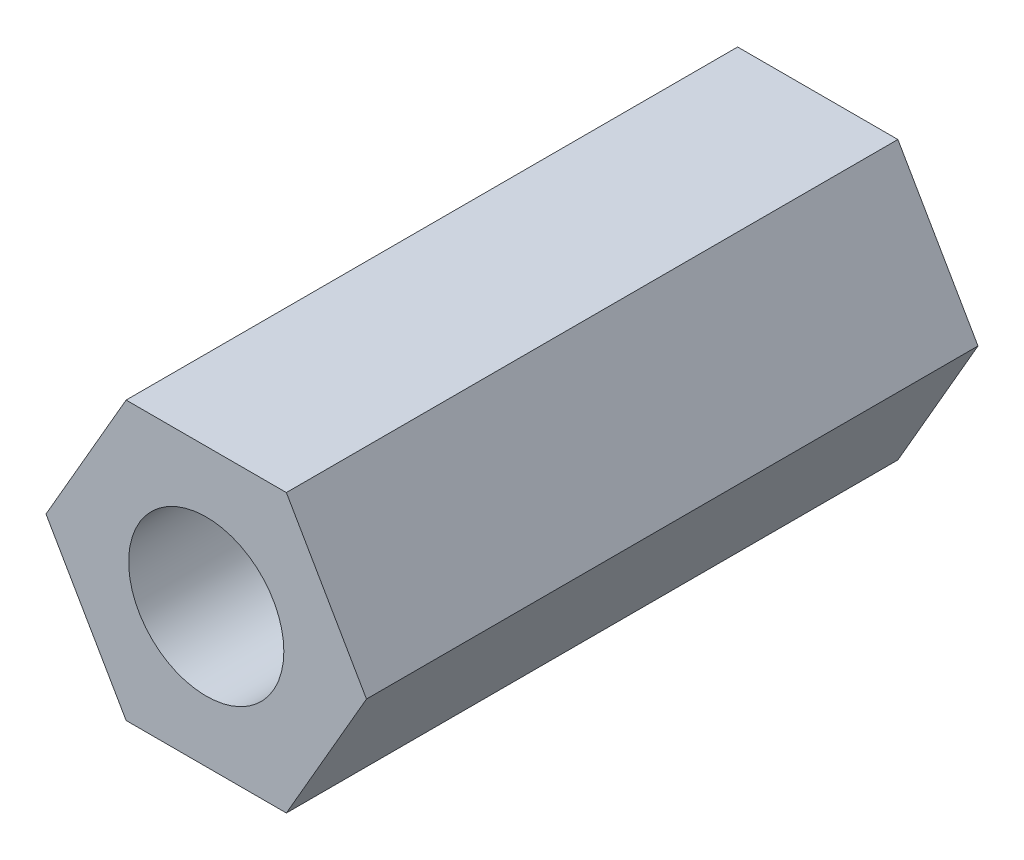
ISO-10303-21;
HEADER;
FILE_DESCRIPTION(('STEP AP214'),'2;1');
FILE_NAME('part.step','',(''),(''),'','','');
FILE_SCHEMA(('AUTOMOTIVE_DESIGN { 1 0 10303 214 1 1 1 1 }'));
ENDSEC;
DATA;
#1=APPLICATION_CONTEXT('core data for automotive mechanical design processes');
#2=APPLICATION_PROTOCOL_DEFINITION('international standard','automotive_design',2000,#1);
#3=PRODUCT_CONTEXT('',#1,'mechanical');
#4=PRODUCT('Part','Part','',(#3));
#5=PRODUCT_RELATED_PRODUCT_CATEGORY('part','',(#4));
#6=PRODUCT_DEFINITION_FORMATION('','',#4);
#7=PRODUCT_DEFINITION_CONTEXT('part definition',#1,'design');
#8=PRODUCT_DEFINITION('design','',#6,#7);
#9=PRODUCT_DEFINITION_SHAPE('','',#8);
#10=(LENGTH_UNIT() NAMED_UNIT(*) SI_UNIT(.MILLI.,.METRE.));
#11=(NAMED_UNIT(*) PLANE_ANGLE_UNIT() SI_UNIT($,.RADIAN.));
#12=(NAMED_UNIT(*) SI_UNIT($,.STERADIAN.) SOLID_ANGLE_UNIT());
#13=UNCERTAINTY_MEASURE_WITH_UNIT(LENGTH_MEASURE(1.E-05),#10,'distance_accuracy_value','');
#14=(GEOMETRIC_REPRESENTATION_CONTEXT(3) GLOBAL_UNCERTAINTY_ASSIGNED_CONTEXT((#13)) GLOBAL_UNIT_ASSIGNED_CONTEXT((#10,
#11,#12)) REPRESENTATION_CONTEXT('',''));
#15=CARTESIAN_POINT('',(0.,0.,0.));
#16=DIRECTION('',(0.,0.,1.));
#17=DIRECTION('',(1.,0.,0.));
#18=AXIS2_PLACEMENT_3D('',#15,#16,#17);
#19=CARTESIAN_POINT('',(3.40636658821879,0.,13.));
#20=DIRECTION('',(-0.866025403784438,-0.5,0.));
#21=DIRECTION('',(0.5,-0.866025403784439,0.));
#22=AXIS2_PLACEMENT_3D('',#19,#20,#21);
#23=PLANE('',#22);
#24=DIRECTION('',(-0.5,0.866025403784438,0.));
#25=VECTOR('',#24,1.);
#26=CARTESIAN_POINT('',(3.40636658821879,0.,0.));
#27=LINE('',#26,#25);
#28=CARTESIAN_POINT('',(3.40636658821879,0.,0.));
#29=VERTEX_POINT('',#28);
#30=CARTESIAN_POINT('',(1.7031832941094,2.95,0.));
#31=VERTEX_POINT('',#30);
#32=EDGE_CURVE('E129',#29,#31,#27,.T.);
#33=ORIENTED_EDGE('',*,*,#32,.T.);
#34=DIRECTION('',(0.,0.,-1.));
#35=VECTOR('',#34,1.);
#36=CARTESIAN_POINT('',(1.7031832941094,2.95,13.));
#37=LINE('',#36,#35);
#38=CARTESIAN_POINT('',(1.7031832941094,2.95,13.));
#39=VERTEX_POINT('',#38);
#40=EDGE_CURVE('E11',#39,#31,#37,.T.);
#41=ORIENTED_EDGE('',*,*,#40,.F.);
#42=DIRECTION('',(-0.5,0.866025403784438,0.));
#43=VECTOR('',#42,1.);
#44=CARTESIAN_POINT('',(3.40636658821879,0.,13.));
#45=LINE('',#44,#43);
#46=CARTESIAN_POINT('',(3.40636658821879,0.,13.));
#47=VERTEX_POINT('',#46);
#48=EDGE_CURVE('E140',#47,#39,#45,.T.);
#49=ORIENTED_EDGE('',*,*,#48,.F.);
#50=DIRECTION('',(0.,0.,-1.));
#51=VECTOR('',#50,1.);
#52=CARTESIAN_POINT('',(3.40636658821879,0.,13.));
#53=LINE('',#52,#51);
#54=EDGE_CURVE('E125',#47,#29,#53,.T.);
#55=ORIENTED_EDGE('',*,*,#54,.T.);
#56=EDGE_LOOP('',(#33,#41,#49,#55));
#57=FACE_BOUND('',#56,.T.);
#58=ADVANCED_FACE('F45',(#57),#23,.F.);
#59=CARTESIAN_POINT('',(1.7031832941094,2.95,13.));
#60=DIRECTION('',(0.,-1.,0.));
#61=DIRECTION('',(0.,0.,-1.));
#62=AXIS2_PLACEMENT_3D('',#59,#60,#61);
#63=PLANE('',#62);
#64=DIRECTION('',(-1.,0.,0.));
#65=VECTOR('',#64,1.);
#66=CARTESIAN_POINT('',(1.7031832941094,2.95,0.));
#67=LINE('',#66,#65);
#68=CARTESIAN_POINT('',(-1.7031832941094,2.95,0.));
#69=VERTEX_POINT('',#68);
#70=EDGE_CURVE('E132',#31,#69,#67,.T.);
#71=ORIENTED_EDGE('',*,*,#70,.T.);
#72=DIRECTION('',(0.,0.,-1.));
#73=VECTOR('',#72,1.);
#74=CARTESIAN_POINT('',(-1.7031832941094,2.95,13.));
#75=LINE('',#74,#73);
#76=CARTESIAN_POINT('',(-1.7031832941094,2.95,13.));
#77=VERTEX_POINT('',#76);
#78=EDGE_CURVE('E53',#77,#69,#75,.T.);
#79=ORIENTED_EDGE('',*,*,#78,.F.);
#80=DIRECTION('',(-1.,0.,0.));
#81=VECTOR('',#80,1.);
#82=CARTESIAN_POINT('',(1.7031832941094,2.95,13.));
#83=LINE('',#82,#81);
#84=EDGE_CURVE('E98',#39,#77,#83,.T.);
#85=ORIENTED_EDGE('',*,*,#84,.F.);
#86=ORIENTED_EDGE('',*,*,#40,.T.);
#87=EDGE_LOOP('',(#71,#79,#85,#86));
#88=FACE_BOUND('',#87,.T.);
#89=ADVANCED_FACE('F165',(#88),#63,.F.);
#90=CARTESIAN_POINT('',(-1.7031832941094,2.95,13.));
#91=DIRECTION('',(0.866025403784439,-0.5,0.));
#92=DIRECTION('',(0.5,0.866025403784439,0.));
#93=AXIS2_PLACEMENT_3D('',#90,#91,#92);
#94=PLANE('',#93);
#95=DIRECTION('',(-0.5,-0.866025403784439,0.));
#96=VECTOR('',#95,1.);
#97=CARTESIAN_POINT('',(-1.7031832941094,2.95,0.));
#98=LINE('',#97,#96);
#99=CARTESIAN_POINT('',(-3.40636658821879,0.,0.));
#100=VERTEX_POINT('',#99);
#101=EDGE_CURVE('E135',#69,#100,#98,.T.);
#102=ORIENTED_EDGE('',*,*,#101,.T.);
#103=DIRECTION('',(0.,0.,-1.));
#104=VECTOR('',#103,1.);
#105=CARTESIAN_POINT('',(-3.40636658821879,0.,13.));
#106=LINE('',#105,#104);
#107=CARTESIAN_POINT('',(-3.40636658821879,0.,13.));
#108=VERTEX_POINT('',#107);
#109=EDGE_CURVE('E120',#108,#100,#106,.T.);
#110=ORIENTED_EDGE('',*,*,#109,.F.);
#111=DIRECTION('',(-0.5,-0.866025403784439,0.));
#112=VECTOR('',#111,1.);
#113=CARTESIAN_POINT('',(-1.7031832941094,2.95,13.));
#114=LINE('',#113,#112);
#115=EDGE_CURVE('E111',#77,#108,#114,.T.);
#116=ORIENTED_EDGE('',*,*,#115,.F.);
#117=ORIENTED_EDGE('',*,*,#78,.T.);
#118=EDGE_LOOP('',(#102,#110,#116,#117));
#119=FACE_BOUND('',#118,.T.);
#120=ADVANCED_FACE('F146',(#119),#94,.F.);
#121=CARTESIAN_POINT('',(-3.40636658821879,0.,13.));
#122=DIRECTION('',(0.866025403784438,0.5,0.));
#123=DIRECTION('',(-0.5,0.866025403784439,0.));
#124=AXIS2_PLACEMENT_3D('',#121,#122,#123);
#125=PLANE('',#124);
#126=DIRECTION('',(0.5,-0.866025403784438,0.));
#127=VECTOR('',#126,1.);
#128=CARTESIAN_POINT('',(-3.40636658821879,0.,0.));
#129=LINE('',#128,#127);
#130=CARTESIAN_POINT('',(-1.70318329410939,-2.95,0.));
#131=VERTEX_POINT('',#130);
#132=EDGE_CURVE('E119',#100,#131,#129,.T.);
#133=ORIENTED_EDGE('',*,*,#132,.T.);
#134=DIRECTION('',(0.,0.,-1.));
#135=VECTOR('',#134,1.);
#136=CARTESIAN_POINT('',(-1.70318329410939,-2.95,13.));
#137=LINE('',#136,#135);
#138=CARTESIAN_POINT('',(-1.70318329410939,-2.95,13.));
#139=VERTEX_POINT('',#138);
#140=EDGE_CURVE('E116',#139,#131,#137,.T.);
#141=ORIENTED_EDGE('',*,*,#140,.F.);
#142=DIRECTION('',(0.5,-0.866025403784438,0.));
#143=VECTOR('',#142,1.);
#144=CARTESIAN_POINT('',(-3.40636658821879,0.,13.));
#145=LINE('',#144,#143);
#146=EDGE_CURVE('E105',#108,#139,#145,.T.);
#147=ORIENTED_EDGE('',*,*,#146,.F.);
#148=ORIENTED_EDGE('',*,*,#109,.T.);
#149=EDGE_LOOP('',(#133,#141,#147,#148));
#150=FACE_BOUND('',#149,.T.);
#151=ADVANCED_FACE('F117',(#150),#125,.F.);
#152=CARTESIAN_POINT('',(-1.70318329410939,-2.95,13.));
#153=DIRECTION('',(0.,1.,0.));
#154=DIRECTION('',(-1.,0.,0.));
#155=AXIS2_PLACEMENT_3D('',#152,#153,#154);
#156=PLANE('',#155);
#157=DIRECTION('',(1.,0.,0.));
#158=VECTOR('',#157,1.);
#159=CARTESIAN_POINT('',(-1.70318329410939,-2.95,0.));
#160=LINE('',#159,#158);
#161=CARTESIAN_POINT('',(1.7031832941094,-2.95,0.));
#162=VERTEX_POINT('',#161);
#163=EDGE_CURVE('E84',#131,#162,#160,.T.);
#164=ORIENTED_EDGE('',*,*,#163,.T.);
#165=DIRECTION('',(0.,0.,-1.));
#166=VECTOR('',#165,1.);
#167=CARTESIAN_POINT('',(1.7031832941094,-2.95,13.));
#168=LINE('',#167,#166);
#169=CARTESIAN_POINT('',(1.7031832941094,-2.95,13.));
#170=VERTEX_POINT('',#169);
#171=EDGE_CURVE('E121',#170,#162,#168,.T.);
#172=ORIENTED_EDGE('',*,*,#171,.F.);
#173=DIRECTION('',(1.,0.,0.));
#174=VECTOR('',#173,1.);
#175=CARTESIAN_POINT('',(-1.70318329410939,-2.95,13.));
#176=LINE('',#175,#174);
#177=EDGE_CURVE('E109',#139,#170,#176,.T.);
#178=ORIENTED_EDGE('',*,*,#177,.F.);
#179=ORIENTED_EDGE('',*,*,#140,.T.);
#180=EDGE_LOOP('',(#164,#172,#178,#179));
#181=FACE_BOUND('',#180,.T.);
#182=ADVANCED_FACE('F123',(#181),#156,.F.);
#183=CARTESIAN_POINT('',(1.7031832941094,-2.95,13.));
#184=DIRECTION('',(-0.866025403784439,0.5,0.));
#185=DIRECTION('',(-0.5,-0.866025403784439,0.));
#186=AXIS2_PLACEMENT_3D('',#183,#184,#185);
#187=PLANE('',#186);
#188=DIRECTION('',(0.5,0.866025403784439,0.));
#189=VECTOR('',#188,1.);
#190=CARTESIAN_POINT('',(1.7031832941094,-2.95,0.));
#191=LINE('',#190,#189);
#192=EDGE_CURVE('E90',#162,#29,#191,.T.);
#193=ORIENTED_EDGE('',*,*,#192,.T.);
#194=ORIENTED_EDGE('',*,*,#54,.F.);
#195=DIRECTION('',(0.5,0.866025403784439,0.));
#196=VECTOR('',#195,1.);
#197=CARTESIAN_POINT('',(1.7031832941094,-2.95,13.));
#198=LINE('',#197,#196);
#199=EDGE_CURVE('E61',#170,#47,#198,.T.);
#200=ORIENTED_EDGE('',*,*,#199,.F.);
#201=ORIENTED_EDGE('',*,*,#171,.T.);
#202=EDGE_LOOP('',(#193,#194,#200,#201));
#203=FACE_BOUND('',#202,.T.);
#204=ADVANCED_FACE('F153',(#203),#187,.F.);
#205=CARTESIAN_POINT('',(0.,0.,13.));
#206=DIRECTION('',(0.,0.,1.));
#207=DIRECTION('',(1.,0.,0.));
#208=AXIS2_PLACEMENT_3D('',#205,#206,#207);
#209=PLANE('',#208);
#210=CARTESIAN_POINT('',(0.,0.,13.));
#211=DIRECTION('',(0.,0.,1.));
#212=DIRECTION('',(1.,0.,0.));
#213=AXIS2_PLACEMENT_3D('',#210,#211,#212);
#214=CIRCLE('',#213,1.65);
#215=CARTESIAN_POINT('',(1.65,0.,13.));
#216=VERTEX_POINT('',#215);
#217=EDGE_CURVE('E216',#216,#216,#214,.T.);
#218=ORIENTED_EDGE('',*,*,#217,.F.);
#219=EDGE_LOOP('',(#218));
#220=FACE_BOUND('',#219,.T.);
#221=ORIENTED_EDGE('',*,*,#48,.T.);
#222=ORIENTED_EDGE('',*,*,#84,.T.);
#223=ORIENTED_EDGE('',*,*,#115,.T.);
#224=ORIENTED_EDGE('',*,*,#146,.T.);
#225=ORIENTED_EDGE('',*,*,#177,.T.);
#226=ORIENTED_EDGE('',*,*,#199,.T.);
#227=EDGE_LOOP('',(#221,#222,#223,#224,#225,#226));
#228=FACE_BOUND('',#227,.T.);
#229=ADVANCED_FACE('F107',(#220,#228),#209,.T.);
#230=CARTESIAN_POINT('',(0.,0.,0.));
#231=DIRECTION('',(0.,0.,1.));
#232=DIRECTION('',(1.,0.,0.));
#233=AXIS2_PLACEMENT_3D('',#230,#231,#232);
#234=PLANE('',#233);
#235=CARTESIAN_POINT('',(0.,0.,0.));
#236=DIRECTION('',(0.,0.,1.));
#237=DIRECTION('',(1.,0.,0.));
#238=AXIS2_PLACEMENT_3D('',#235,#236,#237);
#239=CIRCLE('',#238,1.65);
#240=CARTESIAN_POINT('',(1.65,0.,0.));
#241=VERTEX_POINT('',#240);
#242=EDGE_CURVE('E133',#241,#241,#239,.T.);
#243=ORIENTED_EDGE('',*,*,#242,.T.);
#244=EDGE_LOOP('',(#243));
#245=FACE_BOUND('',#244,.T.);
#246=ORIENTED_EDGE('',*,*,#32,.F.);
#247=ORIENTED_EDGE('',*,*,#192,.F.);
#248=ORIENTED_EDGE('',*,*,#163,.F.);
#249=ORIENTED_EDGE('',*,*,#132,.F.);
#250=ORIENTED_EDGE('',*,*,#101,.F.);
#251=ORIENTED_EDGE('',*,*,#70,.F.);
#252=EDGE_LOOP('',(#246,#247,#248,#249,#250,#251));
#253=FACE_BOUND('',#252,.T.);
#254=ADVANCED_FACE('F149',(#245,#253),#234,.F.);
#255=CARTESIAN_POINT('',(0.,0.,13.));
#256=DIRECTION('',(0.,0.,1.));
#257=DIRECTION('',(1.,0.,0.));
#258=AXIS2_PLACEMENT_3D('',#255,#256,#257);
#259=CYLINDRICAL_SURFACE('',#258,1.65);
#260=ORIENTED_EDGE('',*,*,#242,.F.);
#261=EDGE_LOOP('',(#260));
#262=FACE_BOUND('',#261,.T.);
#263=ORIENTED_EDGE('',*,*,#217,.T.);
#264=EDGE_LOOP('',(#263));
#265=FACE_BOUND('',#264,.T.);
#266=ADVANCED_FACE('F196',(#262,#265),#259,.F.);
#267=CLOSED_SHELL('',(#58,#89,#120,#151,#182,#204,#229,#254,#266));
#268=MANIFOLD_SOLID_BREP('B2',#267);
#269=ADVANCED_BREP_SHAPE_REPRESENTATION('',(#18,#268),#14);
#270=SHAPE_DEFINITION_REPRESENTATION(#9,#269);
ENDSEC;
END-ISO-10303-21;
